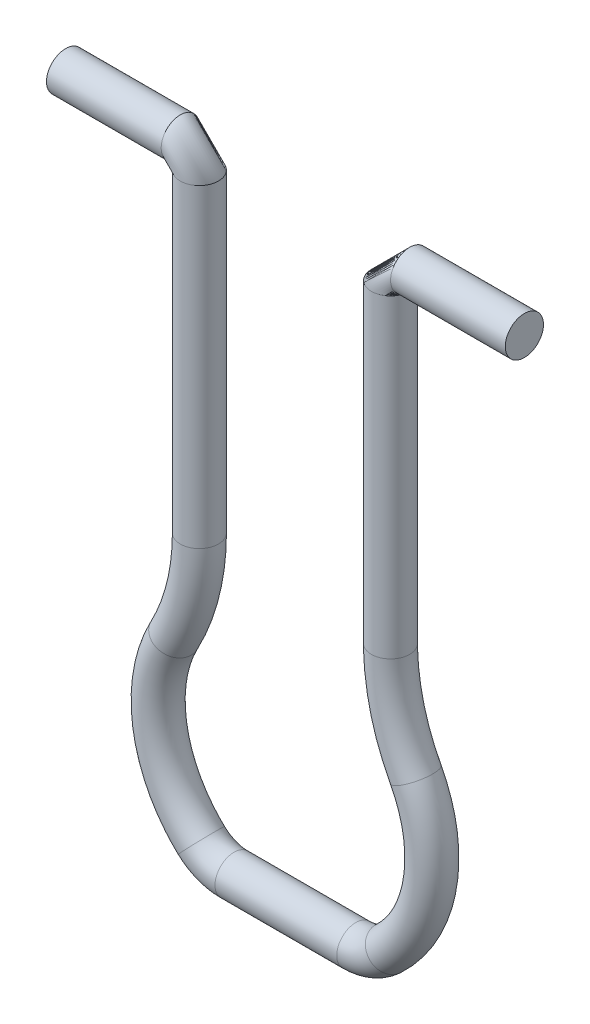
ISO-10303-21;
HEADER;
FILE_DESCRIPTION(('STEP AP214'),'2;1');
FILE_NAME('part.step','',(''),(''),'','','');
FILE_SCHEMA(('AUTOMOTIVE_DESIGN { 1 0 10303 214 1 1 1 1 }'));
ENDSEC;
DATA;
#1=APPLICATION_CONTEXT('core data for automotive mechanical design processes');
#2=APPLICATION_PROTOCOL_DEFINITION('international standard','automotive_design',2000,#1);
#3=PRODUCT_CONTEXT('',#1,'mechanical');
#4=PRODUCT('Part','Part','',(#3));
#5=PRODUCT_RELATED_PRODUCT_CATEGORY('part','',(#4));
#6=PRODUCT_DEFINITION_FORMATION('','',#4);
#7=PRODUCT_DEFINITION_CONTEXT('part definition',#1,'design');
#8=PRODUCT_DEFINITION('design','',#6,#7);
#9=PRODUCT_DEFINITION_SHAPE('','',#8);
#10=(LENGTH_UNIT() NAMED_UNIT(*) SI_UNIT(.MILLI.,.METRE.));
#11=(NAMED_UNIT(*) PLANE_ANGLE_UNIT() SI_UNIT($,.RADIAN.));
#12=(NAMED_UNIT(*) SI_UNIT($,.STERADIAN.) SOLID_ANGLE_UNIT());
#13=UNCERTAINTY_MEASURE_WITH_UNIT(LENGTH_MEASURE(1.E-05),#10,'distance_accuracy_value','');
#14=(GEOMETRIC_REPRESENTATION_CONTEXT(3) GLOBAL_UNCERTAINTY_ASSIGNED_CONTEXT((#13)) GLOBAL_UNIT_ASSIGNED_CONTEXT((#10,
#11,#12)) REPRESENTATION_CONTEXT('',''));
#15=CARTESIAN_POINT('',(0.,0.,0.));
#16=DIRECTION('',(0.,0.,1.));
#17=DIRECTION('',(1.,0.,0.));
#18=AXIS2_PLACEMENT_3D('',#15,#16,#17);
#19=CARTESIAN_POINT('',(-6.096,0.,0.));
#20=DIRECTION('',(1.,0.,0.));
#21=DIRECTION('',(0.,0.,-1.));
#22=AXIS2_PLACEMENT_3D('',#19,#20,#21);
#23=PLANE('',#22);
#24=CARTESIAN_POINT('',(-6.096,0.,0.));
#25=DIRECTION('',(1.,0.,0.));
#26=DIRECTION('',(0.,0.,-1.));
#27=AXIS2_PLACEMENT_3D('',#24,#25,#26);
#28=CIRCLE('',#27,0.508);
#29=CARTESIAN_POINT('',(-6.096,0.,-0.508));
#30=VERTEX_POINT('',#29);
#31=EDGE_CURVE('E88',#30,#30,#28,.T.);
#32=ORIENTED_EDGE('',*,*,#31,.F.);
#33=EDGE_LOOP('',(#32));
#34=FACE_BOUND('',#33,.T.);
#35=ADVANCED_FACE('F36',(#34),#23,.F.);
#36=CARTESIAN_POINT('',(6.096,0.,0.));
#37=DIRECTION('',(1.,0.,0.));
#38=DIRECTION('',(0.,0.,-1.));
#39=AXIS2_PLACEMENT_3D('',#36,#37,#38);
#40=PLANE('',#39);
#41=CARTESIAN_POINT('',(6.096,0.,0.));
#42=DIRECTION('',(1.,0.,0.));
#43=DIRECTION('',(0.,0.,-1.));
#44=AXIS2_PLACEMENT_3D('',#41,#42,#43);
#45=CIRCLE('',#44,0.508);
#46=CARTESIAN_POINT('',(6.096,0.,-0.508));
#47=VERTEX_POINT('',#46);
#48=EDGE_CURVE('E11',#47,#47,#45,.T.);
#49=ORIENTED_EDGE('',*,*,#48,.T.);
#50=EDGE_LOOP('',(#49));
#51=FACE_BOUND('',#50,.T.);
#52=ADVANCED_FACE('F95',(#51),#40,.T.);
#53=CARTESIAN_POINT('',(-6.096,0.,0.));
#54=DIRECTION('',(1.,0.,0.));
#55=DIRECTION('',(0.,0.,-1.));
#56=AXIS2_PLACEMENT_3D('',#53,#54,#55);
#57=CYLINDRICAL_SURFACE('',#56,0.508);
#58=CARTESIAN_POINT('',(-3.048,0.,0.));
#59=DIRECTION('',(1.,0.,0.));
#60=DIRECTION('',(0.,0.,-1.));
#61=AXIS2_PLACEMENT_3D('',#58,#59,#60);
#62=CIRCLE('',#61,0.508);
#63=CARTESIAN_POINT('',(-3.048,-0.508,0.));
#64=VERTEX_POINT('',#63);
#65=EDGE_CURVE('E48',#64,#64,#62,.T.);
#66=ORIENTED_EDGE('',*,*,#65,.F.);
#67=EDGE_LOOP('',(#66));
#68=FACE_BOUND('',#67,.T.);
#69=ORIENTED_EDGE('',*,*,#31,.T.);
#70=EDGE_LOOP('',(#69));
#71=FACE_BOUND('',#70,.T.);
#72=ADVANCED_FACE('F92',(#68,#71),#57,.T.);
#73=CARTESIAN_POINT('',(-3.048,-0.508,0.));
#74=DIRECTION('',(0.,0.,-1.));
#75=DIRECTION('',(-1.,0.,0.));
#76=AXIS2_PLACEMENT_3D('',#73,#74,#75);
#77=TOROIDAL_SURFACE('',#76,0.508,0.508);
#78=CARTESIAN_POINT('',(-2.54,-0.508,0.));
#79=DIRECTION('',(0.,-1.,0.));
#80=DIRECTION('',(0.,0.,-1.));
#81=AXIS2_PLACEMENT_3D('',#78,#79,#80);
#82=CIRCLE('',#81,0.508);
#83=EDGE_CURVE('E84',#64,#64,#82,.T.);
#84=ORIENTED_EDGE('',*,*,#83,.F.);
#85=ORIENTED_EDGE('',*,*,#65,.T.);
#86=EDGE_LOOP('',(#84,#85));
#87=FACE_BOUND('',#86,.T.);
#88=ADVANCED_FACE('F145',(#87),#77,.T.);
#89=CARTESIAN_POINT('',(-2.54,-0.508,0.));
#90=DIRECTION('',(0.,-1.,0.));
#91=DIRECTION('',(1.,0.,0.));
#92=AXIS2_PLACEMENT_3D('',#89,#90,#91);
#93=CYLINDRICAL_SURFACE('',#92,0.508);
#94=CARTESIAN_POINT('',(-2.54,-8.86309788427772,0.));
#95=DIRECTION('',(0.,-1.,0.));
#96=DIRECTION('',(0.,0.,-1.));
#97=AXIS2_PLACEMENT_3D('',#94,#95,#96);
#98=CIRCLE('',#97,0.508);
#99=CARTESIAN_POINT('',(-2.032,-8.86309788427772,0.));
#100=VERTEX_POINT('',#99);
#101=EDGE_CURVE('E81',#100,#100,#98,.T.);
#102=ORIENTED_EDGE('',*,*,#101,.F.);
#103=EDGE_LOOP('',(#102));
#104=FACE_BOUND('',#103,.T.);
#105=ORIENTED_EDGE('',*,*,#83,.T.);
#106=EDGE_LOOP('',(#105));
#107=FACE_BOUND('',#106,.T.);
#108=ADVANCED_FACE('F141',(#104,#107),#93,.T.);
#109=CARTESIAN_POINT('',(-8.255,-8.86309788427772,0.));
#110=DIRECTION('',(0.,0.,-1.));
#111=DIRECTION('',(-1.,0.,0.));
#112=AXIS2_PLACEMENT_3D('',#109,#110,#111);
#113=TOROIDAL_SURFACE('',#112,5.715,0.508);
#114=CARTESIAN_POINT('',(-3.21042252857446,-11.5488869926751,0.));
#115=DIRECTION('',(-0.469954349675827,-0.882690721159325,0.));
#116=DIRECTION('',(0.,0.,-1.));
#117=AXIS2_PLACEMENT_3D('',#114,#115,#116);
#118=CIRCLE('',#117,0.508);
#119=CARTESIAN_POINT('',(-2.76201564222552,-11.7876238023104,0.));
#120=VERTEX_POINT('',#119);
#121=EDGE_CURVE('E78',#120,#120,#118,.T.);
#122=CARTESIAN_POINT('',(-8.255,-8.86309788427772,0.));
#123=DIRECTION('',(0.,0.,-1.));
#124=DIRECTION('',(-1.,0.,0.));
#125=AXIS2_PLACEMENT_3D('',#122,#123,#124);
#126=CIRCLE('',#125,6.223);
#127=EDGE_CURVE('',#100,#120,#126,.T.);
#128=ORIENTED_EDGE('',*,*,#101,.T.);
#129=ORIENTED_EDGE('',*,*,#121,.F.);
#130=ORIENTED_EDGE('',*,*,#127,.T.);
#131=ORIENTED_EDGE('',*,*,#127,.F.);
#132=EDGE_LOOP('',(#128,#130,#129,#131));
#133=FACE_BOUND('',#132,.T.);
#134=ADVANCED_FACE('F137',(#133),#113,.T.);
#135=CARTESIAN_POINT('',(0.,-13.2581516257271,0.));
#136=DIRECTION('',(0.,0.,1.));
#137=DIRECTION('',(1.,0.,0.));
#138=AXIS2_PLACEMENT_3D('',#135,#136,#137);
#139=TOROIDAL_SURFACE('',#138,3.63708652602339,0.508);
#140=CARTESIAN_POINT('',(-2.48596118944514,-15.9130330472511,0.));
#141=DIRECTION('',(0.729947281300105,-0.683503450263848,0.));
#142=DIRECTION('',(0.,0.,-1.));
#143=AXIS2_PLACEMENT_3D('',#140,#141,#142);
#144=CIRCLE('',#143,0.508);
#145=CARTESIAN_POINT('',(-2.83318094217918,-16.2838462661516,0.));
#146=VERTEX_POINT('',#145);
#147=EDGE_CURVE('E75',#146,#146,#144,.T.);
#148=ORIENTED_EDGE('',*,*,#147,.F.);
#149=EDGE_LOOP('',(#148));
#150=FACE_BOUND('',#149,.T.);
#151=ORIENTED_EDGE('',*,*,#121,.T.);
#152=EDGE_LOOP('',(#151));
#153=FACE_BOUND('',#152,.T.);
#154=ADVANCED_FACE('F133',(#150,#153),#139,.T.);
#155=CARTESIAN_POINT('',(-1.61791180761006,-14.986,0.));
#156=DIRECTION('',(0.,0.,1.));
#157=DIRECTION('',(1.,0.,0.));
#158=AXIS2_PLACEMENT_3D('',#155,#156,#157);
#159=TOROIDAL_SURFACE('',#158,1.27,0.508);
#160=CARTESIAN_POINT('',(-1.61791180761006,-16.256,0.));
#161=DIRECTION('',(1.,0.,0.));
#162=DIRECTION('',(0.,0.,-1.));
#163=AXIS2_PLACEMENT_3D('',#160,#161,#162);
#164=CIRCLE('',#163,0.508);
#165=CARTESIAN_POINT('',(-1.61791180761006,-16.764,0.));
#166=VERTEX_POINT('',#165);
#167=EDGE_CURVE('E72',#166,#166,#164,.T.);
#168=CARTESIAN_POINT('',(-1.61791180761006,-14.986,0.));
#169=DIRECTION('',(0.,0.,1.));
#170=DIRECTION('',(1.,0.,0.));
#171=AXIS2_PLACEMENT_3D('',#168,#169,#170);
#172=CIRCLE('',#171,1.778);
#173=EDGE_CURVE('',#146,#166,#172,.T.);
#174=ORIENTED_EDGE('',*,*,#147,.T.);
#175=ORIENTED_EDGE('',*,*,#167,.F.);
#176=ORIENTED_EDGE('',*,*,#173,.T.);
#177=ORIENTED_EDGE('',*,*,#173,.F.);
#178=EDGE_LOOP('',(#174,#176,#175,#177));
#179=FACE_BOUND('',#178,.T.);
#180=ADVANCED_FACE('F129',(#179),#159,.T.);
#181=CARTESIAN_POINT('',(-1.61791180761006,-16.256,0.));
#182=DIRECTION('',(1.,0.,0.));
#183=DIRECTION('',(0.,0.,-1.));
#184=AXIS2_PLACEMENT_3D('',#181,#182,#183);
#185=CYLINDRICAL_SURFACE('',#184,0.508);
#186=CARTESIAN_POINT('',(1.61791180761006,-16.256,0.));
#187=DIRECTION('',(1.,0.,0.));
#188=DIRECTION('',(0.,0.,-1.));
#189=AXIS2_PLACEMENT_3D('',#186,#187,#188);
#190=CIRCLE('',#189,0.508);
#191=CARTESIAN_POINT('',(1.61791180761006,-16.764,0.));
#192=VERTEX_POINT('',#191);
#193=EDGE_CURVE('E69',#192,#192,#190,.T.);
#194=ORIENTED_EDGE('',*,*,#193,.F.);
#195=EDGE_LOOP('',(#194));
#196=FACE_BOUND('',#195,.T.);
#197=ORIENTED_EDGE('',*,*,#167,.T.);
#198=EDGE_LOOP('',(#197));
#199=FACE_BOUND('',#198,.T.);
#200=ADVANCED_FACE('F125',(#196,#199),#185,.T.);
#201=CARTESIAN_POINT('',(1.61791180761006,-14.986,0.));
#202=DIRECTION('',(0.,0.,1.));
#203=DIRECTION('',(1.,0.,0.));
#204=AXIS2_PLACEMENT_3D('',#201,#202,#203);
#205=TOROIDAL_SURFACE('',#204,1.27,0.508);
#206=CARTESIAN_POINT('',(2.48596118944515,-15.9130330472511,0.));
#207=DIRECTION('',(0.729947281300106,0.683503450263848,0.));
#208=DIRECTION('',(0.,0.,-1.));
#209=AXIS2_PLACEMENT_3D('',#206,#207,#208);
#210=CIRCLE('',#209,0.508);
#211=CARTESIAN_POINT('',(2.83318094217918,-16.2838462661516,0.));
#212=VERTEX_POINT('',#211);
#213=EDGE_CURVE('E66',#212,#212,#210,.T.);
#214=CARTESIAN_POINT('',(1.61791180761006,-14.986,0.));
#215=DIRECTION('',(0.,0.,1.));
#216=DIRECTION('',(1.,0.,0.));
#217=AXIS2_PLACEMENT_3D('',#214,#215,#216);
#218=CIRCLE('',#217,1.778);
#219=EDGE_CURVE('',#192,#212,#218,.T.);
#220=ORIENTED_EDGE('',*,*,#193,.T.);
#221=ORIENTED_EDGE('',*,*,#213,.F.);
#222=ORIENTED_EDGE('',*,*,#219,.T.);
#223=ORIENTED_EDGE('',*,*,#219,.F.);
#224=EDGE_LOOP('',(#220,#222,#221,#223));
#225=FACE_BOUND('',#224,.T.);
#226=ADVANCED_FACE('F121',(#225),#205,.T.);
#227=CARTESIAN_POINT('',(0.,-13.2581516257271,0.));
#228=DIRECTION('',(0.,0.,1.));
#229=DIRECTION('',(1.,0.,0.));
#230=AXIS2_PLACEMENT_3D('',#227,#228,#229);
#231=TOROIDAL_SURFACE('',#230,3.6370865260234,0.508);
#232=CARTESIAN_POINT('',(3.21042252857446,-11.5488869926751,0.));
#233=DIRECTION('',(-0.469954349675828,0.882690721159325,0.));
#234=DIRECTION('',(0.,0.,-1.));
#235=AXIS2_PLACEMENT_3D('',#232,#233,#234);
#236=CIRCLE('',#235,0.508);
#237=CARTESIAN_POINT('',(3.65882941492339,-11.3101501830398,0.));
#238=VERTEX_POINT('',#237);
#239=EDGE_CURVE('E61',#238,#238,#236,.T.);
#240=CARTESIAN_POINT('',(0.,-13.2581516257271,0.));
#241=DIRECTION('',(0.,0.,1.));
#242=DIRECTION('',(1.,0.,0.));
#243=AXIS2_PLACEMENT_3D('',#240,#241,#242);
#244=CIRCLE('',#243,4.1450865260234);
#245=EDGE_CURVE('',#212,#238,#244,.T.);
#246=ORIENTED_EDGE('',*,*,#213,.T.);
#247=ORIENTED_EDGE('',*,*,#239,.F.);
#248=ORIENTED_EDGE('',*,*,#245,.T.);
#249=ORIENTED_EDGE('',*,*,#245,.F.);
#250=EDGE_LOOP('',(#246,#248,#247,#249));
#251=FACE_BOUND('',#250,.T.);
#252=ADVANCED_FACE('F117',(#251),#231,.T.);
#253=CARTESIAN_POINT('',(8.255,-8.86309788427772,0.));
#254=DIRECTION('',(0.,0.,-1.));
#255=DIRECTION('',(-1.,0.,0.));
#256=AXIS2_PLACEMENT_3D('',#253,#254,#255);
#257=TOROIDAL_SURFACE('',#256,5.715,0.508);
#258=CARTESIAN_POINT('',(2.54,-8.86309788427772,0.));
#259=DIRECTION('',(0.,1.,0.));
#260=DIRECTION('',(0.,0.,-1.));
#261=AXIS2_PLACEMENT_3D('',#258,#259,#260);
#262=CIRCLE('',#261,0.508);
#263=CARTESIAN_POINT('',(2.54,-8.86309788427772,-0.508));
#264=VERTEX_POINT('',#263);
#265=EDGE_CURVE('E58',#264,#264,#262,.T.);
#266=ORIENTED_EDGE('',*,*,#265,.F.);
#267=EDGE_LOOP('',(#266));
#268=FACE_BOUND('',#267,.T.);
#269=ORIENTED_EDGE('',*,*,#239,.T.);
#270=EDGE_LOOP('',(#269));
#271=FACE_BOUND('',#270,.T.);
#272=ADVANCED_FACE('F114',(#268,#271),#257,.T.);
#273=CARTESIAN_POINT('',(2.54,-8.86309788427772,0.));
#274=DIRECTION('',(0.,1.,0.));
#275=DIRECTION('',(0.,0.,1.));
#276=AXIS2_PLACEMENT_3D('',#273,#274,#275);
#277=CYLINDRICAL_SURFACE('',#276,0.508);
#278=CARTESIAN_POINT('',(2.54,-0.508,0.));
#279=DIRECTION('',(0.,1.,0.));
#280=DIRECTION('',(0.,0.,-1.));
#281=AXIS2_PLACEMENT_3D('',#278,#279,#280);
#282=CIRCLE('',#281,0.508);
#283=CARTESIAN_POINT('',(3.048,-0.508,0.));
#284=VERTEX_POINT('',#283);
#285=EDGE_CURVE('E52',#284,#284,#282,.T.);
#286=ORIENTED_EDGE('',*,*,#285,.F.);
#287=EDGE_LOOP('',(#286));
#288=FACE_BOUND('',#287,.T.);
#289=ORIENTED_EDGE('',*,*,#265,.T.);
#290=EDGE_LOOP('',(#289));
#291=FACE_BOUND('',#290,.T.);
#292=ADVANCED_FACE('F53',(#288,#291),#277,.T.);
#293=CARTESIAN_POINT('',(3.048,-0.508,0.));
#294=DIRECTION('',(0.,0.,-1.));
#295=DIRECTION('',(-1.,0.,0.));
#296=AXIS2_PLACEMENT_3D('',#293,#294,#295);
#297=TOROIDAL_SURFACE('',#296,0.508,0.508);
#298=CARTESIAN_POINT('',(3.048,0.,0.));
#299=DIRECTION('',(1.,0.,0.));
#300=DIRECTION('',(0.,0.,-1.));
#301=AXIS2_PLACEMENT_3D('',#298,#299,#300);
#302=CIRCLE('',#301,0.508);
#303=EDGE_CURVE('E43',#284,#284,#302,.T.);
#304=ORIENTED_EDGE('',*,*,#303,.F.);
#305=ORIENTED_EDGE('',*,*,#285,.T.);
#306=EDGE_LOOP('',(#304,#305));
#307=FACE_BOUND('',#306,.T.);
#308=ADVANCED_FACE('F102',(#307),#297,.T.);
#309=CARTESIAN_POINT('',(3.048,0.,0.));
#310=DIRECTION('',(1.,0.,0.));
#311=DIRECTION('',(0.,0.,-1.));
#312=AXIS2_PLACEMENT_3D('',#309,#310,#311);
#313=CYLINDRICAL_SURFACE('',#312,0.508);
#314=ORIENTED_EDGE('',*,*,#48,.F.);
#315=EDGE_LOOP('',(#314));
#316=FACE_BOUND('',#315,.T.);
#317=ORIENTED_EDGE('',*,*,#303,.T.);
#318=EDGE_LOOP('',(#317));
#319=FACE_BOUND('',#318,.T.);
#320=ADVANCED_FACE('F100',(#316,#319),#313,.T.);
#321=CLOSED_SHELL('',(#35,#52,#72,#88,#108,#134,#154,#180,#200,#226,#252,#272,#292,#308,#320));
#322=MANIFOLD_SOLID_BREP('B2',#321);
#323=ADVANCED_BREP_SHAPE_REPRESENTATION('',(#18,#322),#14);
#324=SHAPE_DEFINITION_REPRESENTATION(#9,#323);
ENDSEC;
END-ISO-10303-21;
